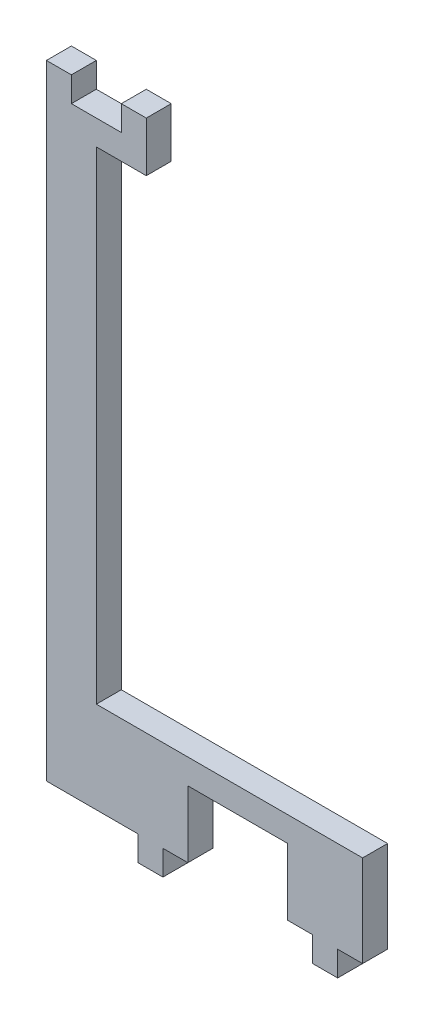
ISO-10303-21;
HEADER;
FILE_DESCRIPTION(('STEP AP214'),'2;1');
FILE_NAME('part.step','',(''),(''),'','','');
FILE_SCHEMA(('AUTOMOTIVE_DESIGN { 1 0 10303 214 1 1 1 1 }'));
ENDSEC;
DATA;
#1=APPLICATION_CONTEXT('core data for automotive mechanical design processes');
#2=APPLICATION_PROTOCOL_DEFINITION('international standard','automotive_design',2000,#1);
#3=PRODUCT_CONTEXT('',#1,'mechanical');
#4=PRODUCT('Part','Part','',(#3));
#5=PRODUCT_RELATED_PRODUCT_CATEGORY('part','',(#4));
#6=PRODUCT_DEFINITION_FORMATION('','',#4);
#7=PRODUCT_DEFINITION_CONTEXT('part definition',#1,'design');
#8=PRODUCT_DEFINITION('design','',#6,#7);
#9=PRODUCT_DEFINITION_SHAPE('','',#8);
#10=(LENGTH_UNIT() NAMED_UNIT(*) SI_UNIT(.MILLI.,.METRE.));
#11=(NAMED_UNIT(*) PLANE_ANGLE_UNIT() SI_UNIT($,.RADIAN.));
#12=(NAMED_UNIT(*) SI_UNIT($,.STERADIAN.) SOLID_ANGLE_UNIT());
#13=UNCERTAINTY_MEASURE_WITH_UNIT(LENGTH_MEASURE(1.E-05),#10,'distance_accuracy_value','');
#14=(GEOMETRIC_REPRESENTATION_CONTEXT(3) GLOBAL_UNCERTAINTY_ASSIGNED_CONTEXT((#13)) GLOBAL_UNIT_ASSIGNED_CONTEXT((#10,
#11,#12)) REPRESENTATION_CONTEXT('',''));
#15=CARTESIAN_POINT('',(0.,0.,0.));
#16=DIRECTION('',(0.,0.,1.));
#17=DIRECTION('',(1.,0.,0.));
#18=AXIS2_PLACEMENT_3D('',#15,#16,#17);
#19=CARTESIAN_POINT('',(17.,-69.,3.));
#20=DIRECTION('',(0.,1.,0.));
#21=DIRECTION('',(-1.,0.,0.));
#22=AXIS2_PLACEMENT_3D('',#19,#20,#21);
#23=PLANE('',#22);
#24=DIRECTION('',(1.,0.,0.));
#25=VECTOR('',#24,1.);
#26=CARTESIAN_POINT('',(17.,-69.,0.));
#27=LINE('',#26,#25);
#28=CARTESIAN_POINT('',(17.,-69.,0.));
#29=VERTEX_POINT('',#28);
#30=CARTESIAN_POINT('',(20.,-69.,0.));
#31=VERTEX_POINT('',#30);
#32=EDGE_CURVE('E240',#29,#31,#27,.T.);
#33=ORIENTED_EDGE('',*,*,#32,.T.);
#34=DIRECTION('',(0.,0.,-1.));
#35=VECTOR('',#34,1.);
#36=CARTESIAN_POINT('',(20.,-69.,3.));
#37=LINE('',#36,#35);
#38=CARTESIAN_POINT('',(20.,-69.,3.));
#39=VERTEX_POINT('',#38);
#40=EDGE_CURVE('E11',#39,#31,#37,.T.);
#41=ORIENTED_EDGE('',*,*,#40,.F.);
#42=DIRECTION('',(1.,0.,0.));
#43=VECTOR('',#42,1.);
#44=CARTESIAN_POINT('',(17.,-69.,3.));
#45=LINE('',#44,#43);
#46=CARTESIAN_POINT('',(17.,-69.,3.));
#47=VERTEX_POINT('',#46);
#48=EDGE_CURVE('E311',#47,#39,#45,.T.);
#49=ORIENTED_EDGE('',*,*,#48,.F.);
#50=DIRECTION('',(0.,0.,-1.));
#51=VECTOR('',#50,1.);
#52=CARTESIAN_POINT('',(17.,-69.,3.));
#53=LINE('',#52,#51);
#54=EDGE_CURVE('E236',#47,#29,#53,.T.);
#55=ORIENTED_EDGE('',*,*,#54,.T.);
#56=EDGE_LOOP('',(#33,#41,#49,#55));
#57=FACE_BOUND('',#56,.T.);
#58=ADVANCED_FACE('F43',(#57),#23,.F.);
#59=CARTESIAN_POINT('',(20.,-69.,3.));
#60=DIRECTION('',(1.,0.,0.));
#61=DIRECTION('',(0.,1.,0.));
#62=AXIS2_PLACEMENT_3D('',#59,#60,#61);
#63=PLANE('',#62);
#64=DIRECTION('',(0.,-1.,0.));
#65=VECTOR('',#64,1.);
#66=CARTESIAN_POINT('',(20.,-69.,0.));
#67=LINE('',#66,#65);
#68=CARTESIAN_POINT('',(20.,-72.,0.));
#69=VERTEX_POINT('',#68);
#70=EDGE_CURVE('E244',#31,#69,#67,.T.);
#71=ORIENTED_EDGE('',*,*,#70,.T.);
#72=DIRECTION('',(0.,0.,-1.));
#73=VECTOR('',#72,1.);
#74=CARTESIAN_POINT('',(20.,-72.,3.));
#75=LINE('',#74,#73);
#76=CARTESIAN_POINT('',(20.,-72.,3.));
#77=VERTEX_POINT('',#76);
#78=EDGE_CURVE('E52',#77,#69,#75,.T.);
#79=ORIENTED_EDGE('',*,*,#78,.F.);
#80=DIRECTION('',(0.,-1.,0.));
#81=VECTOR('',#80,1.);
#82=CARTESIAN_POINT('',(20.,-69.,3.));
#83=LINE('',#82,#81);
#84=EDGE_CURVE('E151',#39,#77,#83,.T.);
#85=ORIENTED_EDGE('',*,*,#84,.F.);
#86=ORIENTED_EDGE('',*,*,#40,.T.);
#87=EDGE_LOOP('',(#71,#79,#85,#86));
#88=FACE_BOUND('',#87,.T.);
#89=ADVANCED_FACE('F489',(#88),#63,.F.);
#90=CARTESIAN_POINT('',(20.,-72.,3.));
#91=DIRECTION('',(0.,1.,0.));
#92=DIRECTION('',(0.,0.,1.));
#93=AXIS2_PLACEMENT_3D('',#90,#91,#92);
#94=PLANE('',#93);
#95=DIRECTION('',(1.,0.,0.));
#96=VECTOR('',#95,1.);
#97=CARTESIAN_POINT('',(20.,-72.,0.));
#98=LINE('',#97,#96);
#99=CARTESIAN_POINT('',(23.,-72.,0.));
#100=VERTEX_POINT('',#99);
#101=EDGE_CURVE('E247',#69,#100,#98,.T.);
#102=ORIENTED_EDGE('',*,*,#101,.T.);
#103=DIRECTION('',(0.,0.,-1.));
#104=VECTOR('',#103,1.);
#105=CARTESIAN_POINT('',(23.,-72.,3.));
#106=LINE('',#105,#104);
#107=CARTESIAN_POINT('',(23.,-72.,3.));
#108=VERTEX_POINT('',#107);
#109=EDGE_CURVE('E386',#108,#100,#106,.T.);
#110=ORIENTED_EDGE('',*,*,#109,.F.);
#111=DIRECTION('',(1.,0.,0.));
#112=VECTOR('',#111,1.);
#113=CARTESIAN_POINT('',(20.,-72.,3.));
#114=LINE('',#113,#112);
#115=EDGE_CURVE('E396',#77,#108,#114,.T.);
#116=ORIENTED_EDGE('',*,*,#115,.F.);
#117=ORIENTED_EDGE('',*,*,#78,.T.);
#118=EDGE_LOOP('',(#102,#110,#116,#117));
#119=FACE_BOUND('',#118,.T.);
#120=ADVANCED_FACE('F394',(#119),#94,.F.);
#121=CARTESIAN_POINT('',(23.,-72.,3.));
#122=DIRECTION('',(-1.,0.,0.));
#123=DIRECTION('',(0.,0.,1.));
#124=AXIS2_PLACEMENT_3D('',#121,#122,#123);
#125=PLANE('',#124);
#126=DIRECTION('',(0.,1.,0.));
#127=VECTOR('',#126,1.);
#128=CARTESIAN_POINT('',(23.,-72.,0.));
#129=LINE('',#128,#127);
#130=CARTESIAN_POINT('',(23.,-69.,0.));
#131=VERTEX_POINT('',#130);
#132=EDGE_CURVE('E250',#100,#131,#129,.T.);
#133=ORIENTED_EDGE('',*,*,#132,.T.);
#134=DIRECTION('',(0.,0.,-1.));
#135=VECTOR('',#134,1.);
#136=CARTESIAN_POINT('',(23.,-69.,3.));
#137=LINE('',#136,#135);
#138=CARTESIAN_POINT('',(23.,-69.,3.));
#139=VERTEX_POINT('',#138);
#140=EDGE_CURVE('E382',#139,#131,#137,.T.);
#141=ORIENTED_EDGE('',*,*,#140,.F.);
#142=DIRECTION('',(0.,1.,0.));
#143=VECTOR('',#142,1.);
#144=CARTESIAN_POINT('',(23.,-72.,3.));
#145=LINE('',#144,#143);
#146=EDGE_CURVE('E415',#108,#139,#145,.T.);
#147=ORIENTED_EDGE('',*,*,#146,.F.);
#148=ORIENTED_EDGE('',*,*,#109,.T.);
#149=EDGE_LOOP('',(#133,#141,#147,#148));
#150=FACE_BOUND('',#149,.T.);
#151=ADVANCED_FACE('F405',(#150),#125,.F.);
#152=CARTESIAN_POINT('',(23.,-69.,3.));
#153=DIRECTION('',(0.,1.,0.));
#154=DIRECTION('',(-1.,0.,0.));
#155=AXIS2_PLACEMENT_3D('',#152,#153,#154);
#156=PLANE('',#155);
#157=DIRECTION('',(1.,0.,0.));
#158=VECTOR('',#157,1.);
#159=CARTESIAN_POINT('',(23.,-69.,0.));
#160=LINE('',#159,#158);
#161=CARTESIAN_POINT('',(26.,-69.,0.));
#162=VERTEX_POINT('',#161);
#163=EDGE_CURVE('E253',#131,#162,#160,.T.);
#164=ORIENTED_EDGE('',*,*,#163,.T.);
#165=DIRECTION('',(0.,0.,-1.));
#166=VECTOR('',#165,1.);
#167=CARTESIAN_POINT('',(26.,-69.,3.));
#168=LINE('',#167,#166);
#169=CARTESIAN_POINT('',(26.,-69.,3.));
#170=VERTEX_POINT('',#169);
#171=EDGE_CURVE('E378',#170,#162,#168,.T.);
#172=ORIENTED_EDGE('',*,*,#171,.F.);
#173=DIRECTION('',(1.,0.,0.));
#174=VECTOR('',#173,1.);
#175=CARTESIAN_POINT('',(23.,-69.,3.));
#176=LINE('',#175,#174);
#177=EDGE_CURVE('E411',#139,#170,#176,.T.);
#178=ORIENTED_EDGE('',*,*,#177,.F.);
#179=ORIENTED_EDGE('',*,*,#140,.T.);
#180=EDGE_LOOP('',(#164,#172,#178,#179));
#181=FACE_BOUND('',#180,.T.);
#182=ADVANCED_FACE('F409',(#181),#156,.F.);
#183=CARTESIAN_POINT('',(26.,-58.,3.));
#184=DIRECTION('',(-1.,0.,0.));
#185=DIRECTION('',(0.,0.,1.));
#186=AXIS2_PLACEMENT_3D('',#183,#184,#185);
#187=PLANE('',#186);
#188=DIRECTION('',(0.,1.,0.));
#189=VECTOR('',#188,1.);
#190=CARTESIAN_POINT('',(26.,-58.,0.));
#191=LINE('',#190,#189);
#192=CARTESIAN_POINT('',(26.,-58.,0.));
#193=VERTEX_POINT('',#192);
#194=EDGE_CURVE('E256',#162,#193,#191,.T.);
#195=ORIENTED_EDGE('',*,*,#194,.T.);
#196=DIRECTION('',(0.,0.,-1.));
#197=VECTOR('',#196,1.);
#198=CARTESIAN_POINT('',(26.,-58.,3.));
#199=LINE('',#198,#197);
#200=CARTESIAN_POINT('',(26.,-58.,3.));
#201=VERTEX_POINT('',#200);
#202=EDGE_CURVE('E374',#201,#193,#199,.T.);
#203=ORIENTED_EDGE('',*,*,#202,.F.);
#204=DIRECTION('',(0.,1.,0.));
#205=VECTOR('',#204,1.);
#206=CARTESIAN_POINT('',(26.,-58.,3.));
#207=LINE('',#206,#205);
#208=EDGE_CURVE('E414',#170,#201,#207,.T.);
#209=ORIENTED_EDGE('',*,*,#208,.F.);
#210=ORIENTED_EDGE('',*,*,#171,.T.);
#211=EDGE_LOOP('',(#195,#203,#209,#210));
#212=FACE_BOUND('',#211,.T.);
#213=ADVANCED_FACE('F502',(#212),#187,.F.);
#214=CARTESIAN_POINT('',(-5.99999999999999,-58.,3.));
#215=DIRECTION('',(0.,-1.,0.));
#216=DIRECTION('',(1.,0.,0.));
#217=AXIS2_PLACEMENT_3D('',#214,#215,#216);
#218=PLANE('',#217);
#219=DIRECTION('',(-1.,0.,0.));
#220=VECTOR('',#219,1.);
#221=CARTESIAN_POINT('',(-5.99999999999999,-58.,0.));
#222=LINE('',#221,#220);
#223=CARTESIAN_POINT('',(-5.99999999999999,-58.,0.));
#224=VERTEX_POINT('',#223);
#225=EDGE_CURVE('E259',#193,#224,#222,.T.);
#226=ORIENTED_EDGE('',*,*,#225,.T.);
#227=DIRECTION('',(0.,0.,-1.));
#228=VECTOR('',#227,1.);
#229=CARTESIAN_POINT('',(-5.99999999999999,-58.,3.));
#230=LINE('',#229,#228);
#231=CARTESIAN_POINT('',(-5.99999999999999,-58.,3.));
#232=VERTEX_POINT('',#231);
#233=EDGE_CURVE('E370',#232,#224,#230,.T.);
#234=ORIENTED_EDGE('',*,*,#233,.F.);
#235=DIRECTION('',(-1.,0.,0.));
#236=VECTOR('',#235,1.);
#237=CARTESIAN_POINT('',(-5.99999999999999,-58.,3.));
#238=LINE('',#237,#236);
#239=EDGE_CURVE('E419',#201,#232,#238,.T.);
#240=ORIENTED_EDGE('',*,*,#239,.F.);
#241=ORIENTED_EDGE('',*,*,#202,.T.);
#242=EDGE_LOOP('',(#226,#234,#240,#241));
#243=FACE_BOUND('',#242,.T.);
#244=ADVANCED_FACE('F505',(#243),#218,.F.);
#245=CARTESIAN_POINT('',(-6.,0.,3.));
#246=DIRECTION('',(-1.,0.,0.));
#247=DIRECTION('',(0.,-1.,0.));
#248=AXIS2_PLACEMENT_3D('',#245,#246,#247);
#249=PLANE('',#248);
#250=DIRECTION('',(0.,1.,0.));
#251=VECTOR('',#250,1.);
#252=CARTESIAN_POINT('',(-6.,0.,0.));
#253=LINE('',#252,#251);
#254=CARTESIAN_POINT('',(-6.,0.,0.));
#255=VERTEX_POINT('',#254);
#256=EDGE_CURVE('E262',#224,#255,#253,.T.);
#257=ORIENTED_EDGE('',*,*,#256,.T.);
#258=DIRECTION('',(0.,0.,-1.));
#259=VECTOR('',#258,1.);
#260=CARTESIAN_POINT('',(-6.,0.,3.));
#261=LINE('',#260,#259);
#262=CARTESIAN_POINT('',(-6.,0.,3.));
#263=VERTEX_POINT('',#262);
#264=EDGE_CURVE('E366',#263,#255,#261,.T.);
#265=ORIENTED_EDGE('',*,*,#264,.F.);
#266=DIRECTION('',(0.,1.,0.));
#267=VECTOR('',#266,1.);
#268=CARTESIAN_POINT('',(-6.,0.,3.));
#269=LINE('',#268,#267);
#270=EDGE_CURVE('E426',#232,#263,#269,.T.);
#271=ORIENTED_EDGE('',*,*,#270,.F.);
#272=ORIENTED_EDGE('',*,*,#233,.T.);
#273=EDGE_LOOP('',(#257,#265,#271,#272));
#274=FACE_BOUND('',#273,.T.);
#275=ADVANCED_FACE('F509',(#274),#249,.F.);
#276=CARTESIAN_POINT('',(0.,0.,3.));
#277=DIRECTION('',(0.,1.,0.));
#278=DIRECTION('',(-1.,0.,0.));
#279=AXIS2_PLACEMENT_3D('',#276,#277,#278);
#280=PLANE('',#279);
#281=DIRECTION('',(1.,0.,0.));
#282=VECTOR('',#281,1.);
#283=CARTESIAN_POINT('',(0.,0.,0.));
#284=LINE('',#283,#282);
#285=CARTESIAN_POINT('',(0.,0.,0.));
#286=VERTEX_POINT('',#285);
#287=EDGE_CURVE('E265',#255,#286,#284,.T.);
#288=ORIENTED_EDGE('',*,*,#287,.T.);
#289=DIRECTION('',(0.,0.,-1.));
#290=VECTOR('',#289,1.);
#291=CARTESIAN_POINT('',(0.,0.,3.));
#292=LINE('',#291,#290);
#293=CARTESIAN_POINT('',(0.,0.,3.));
#294=VERTEX_POINT('',#293);
#295=EDGE_CURVE('E362',#294,#286,#292,.T.);
#296=ORIENTED_EDGE('',*,*,#295,.F.);
#297=DIRECTION('',(1.,0.,0.));
#298=VECTOR('',#297,1.);
#299=CARTESIAN_POINT('',(0.,0.,3.));
#300=LINE('',#299,#298);
#301=EDGE_CURVE('E429',#263,#294,#300,.T.);
#302=ORIENTED_EDGE('',*,*,#301,.F.);
#303=ORIENTED_EDGE('',*,*,#264,.T.);
#304=EDGE_LOOP('',(#288,#296,#302,#303));
#305=FACE_BOUND('',#304,.T.);
#306=ADVANCED_FACE('F513',(#305),#280,.F.);
#307=CARTESIAN_POINT('',(0.,6.,3.));
#308=DIRECTION('',(-1.,0.,0.));
#309=DIRECTION('',(0.,0.,1.));
#310=AXIS2_PLACEMENT_3D('',#307,#308,#309);
#311=PLANE('',#310);
#312=DIRECTION('',(0.,1.,0.));
#313=VECTOR('',#312,1.);
#314=CARTESIAN_POINT('',(0.,6.,0.));
#315=LINE('',#314,#313);
#316=CARTESIAN_POINT('',(0.,6.,0.));
#317=VERTEX_POINT('',#316);
#318=EDGE_CURVE('E268',#286,#317,#315,.T.);
#319=ORIENTED_EDGE('',*,*,#318,.T.);
#320=DIRECTION('',(0.,0.,-1.));
#321=VECTOR('',#320,1.);
#322=CARTESIAN_POINT('',(0.,6.,3.));
#323=LINE('',#322,#321);
#324=CARTESIAN_POINT('',(0.,6.,3.));
#325=VERTEX_POINT('',#324);
#326=EDGE_CURVE('E358',#325,#317,#323,.T.);
#327=ORIENTED_EDGE('',*,*,#326,.F.);
#328=DIRECTION('',(0.,1.,0.));
#329=VECTOR('',#328,1.);
#330=CARTESIAN_POINT('',(0.,6.,3.));
#331=LINE('',#330,#329);
#332=EDGE_CURVE('E432',#294,#325,#331,.T.);
#333=ORIENTED_EDGE('',*,*,#332,.F.);
#334=ORIENTED_EDGE('',*,*,#295,.T.);
#335=EDGE_LOOP('',(#319,#327,#333,#334));
#336=FACE_BOUND('',#335,.T.);
#337=ADVANCED_FACE('F517',(#336),#311,.F.);
#338=CARTESIAN_POINT('',(-3.,6.,3.));
#339=DIRECTION('',(0.,-1.,0.));
#340=DIRECTION('',(1.,0.,0.));
#341=AXIS2_PLACEMENT_3D('',#338,#339,#340);
#342=PLANE('',#341);
#343=DIRECTION('',(-1.,0.,0.));
#344=VECTOR('',#343,1.);
#345=CARTESIAN_POINT('',(-3.,6.,0.));
#346=LINE('',#345,#344);
#347=CARTESIAN_POINT('',(-3.,6.,0.));
#348=VERTEX_POINT('',#347);
#349=EDGE_CURVE('E271',#317,#348,#346,.T.);
#350=ORIENTED_EDGE('',*,*,#349,.T.);
#351=DIRECTION('',(0.,0.,-1.));
#352=VECTOR('',#351,1.);
#353=CARTESIAN_POINT('',(-3.,6.,3.));
#354=LINE('',#353,#352);
#355=CARTESIAN_POINT('',(-3.,6.,3.));
#356=VERTEX_POINT('',#355);
#357=EDGE_CURVE('E354',#356,#348,#354,.T.);
#358=ORIENTED_EDGE('',*,*,#357,.F.);
#359=DIRECTION('',(-1.,0.,0.));
#360=VECTOR('',#359,1.);
#361=CARTESIAN_POINT('',(-3.,6.,3.));
#362=LINE('',#361,#360);
#363=EDGE_CURVE('E435',#325,#356,#362,.T.);
#364=ORIENTED_EDGE('',*,*,#363,.F.);
#365=ORIENTED_EDGE('',*,*,#326,.T.);
#366=EDGE_LOOP('',(#350,#358,#364,#365));
#367=FACE_BOUND('',#366,.T.);
#368=ADVANCED_FACE('F521',(#367),#342,.F.);
#369=CARTESIAN_POINT('',(-3.,2.99999999999999,3.));
#370=DIRECTION('',(1.,0.,0.));
#371=DIRECTION('',(0.,0.,-1.));
#372=AXIS2_PLACEMENT_3D('',#369,#370,#371);
#373=PLANE('',#372);
#374=DIRECTION('',(0.,-1.,0.));
#375=VECTOR('',#374,1.);
#376=CARTESIAN_POINT('',(-3.,2.99999999999999,0.));
#377=LINE('',#376,#375);
#378=CARTESIAN_POINT('',(-3.,2.99999999999999,0.));
#379=VERTEX_POINT('',#378);
#380=EDGE_CURVE('E274',#348,#379,#377,.T.);
#381=ORIENTED_EDGE('',*,*,#380,.T.);
#382=DIRECTION('',(0.,0.,-1.));
#383=VECTOR('',#382,1.);
#384=CARTESIAN_POINT('',(-3.,2.99999999999999,3.));
#385=LINE('',#384,#383);
#386=CARTESIAN_POINT('',(-3.,2.99999999999999,3.));
#387=VERTEX_POINT('',#386);
#388=EDGE_CURVE('E350',#387,#379,#385,.T.);
#389=ORIENTED_EDGE('',*,*,#388,.F.);
#390=DIRECTION('',(0.,-1.,0.));
#391=VECTOR('',#390,1.);
#392=CARTESIAN_POINT('',(-3.,2.99999999999999,3.));
#393=LINE('',#392,#391);
#394=EDGE_CURVE('E438',#356,#387,#393,.T.);
#395=ORIENTED_EDGE('',*,*,#394,.F.);
#396=ORIENTED_EDGE('',*,*,#357,.T.);
#397=EDGE_LOOP('',(#381,#389,#395,#396));
#398=FACE_BOUND('',#397,.T.);
#399=ADVANCED_FACE('F525',(#398),#373,.F.);
#400=CARTESIAN_POINT('',(-9.,3.,3.));
#401=DIRECTION('',(0.,-1.,0.));
#402=DIRECTION('',(1.,0.,0.));
#403=AXIS2_PLACEMENT_3D('',#400,#401,#402);
#404=PLANE('',#403);
#405=DIRECTION('',(-1.,0.,0.));
#406=VECTOR('',#405,1.);
#407=CARTESIAN_POINT('',(-9.,3.,0.));
#408=LINE('',#407,#406);
#409=CARTESIAN_POINT('',(-9.,3.,0.));
#410=VERTEX_POINT('',#409);
#411=EDGE_CURVE('E277',#379,#410,#408,.T.);
#412=ORIENTED_EDGE('',*,*,#411,.T.);
#413=DIRECTION('',(0.,0.,-1.));
#414=VECTOR('',#413,1.);
#415=CARTESIAN_POINT('',(-9.,3.,3.));
#416=LINE('',#415,#414);
#417=CARTESIAN_POINT('',(-9.,3.,3.));
#418=VERTEX_POINT('',#417);
#419=EDGE_CURVE('E346',#418,#410,#416,.T.);
#420=ORIENTED_EDGE('',*,*,#419,.F.);
#421=DIRECTION('',(-1.,0.,0.));
#422=VECTOR('',#421,1.);
#423=CARTESIAN_POINT('',(-9.,3.,3.));
#424=LINE('',#423,#422);
#425=EDGE_CURVE('E441',#387,#418,#424,.T.);
#426=ORIENTED_EDGE('',*,*,#425,.F.);
#427=ORIENTED_EDGE('',*,*,#388,.T.);
#428=EDGE_LOOP('',(#412,#420,#426,#427));
#429=FACE_BOUND('',#428,.T.);
#430=ADVANCED_FACE('F529',(#429),#404,.F.);
#431=CARTESIAN_POINT('',(-9.,6.,3.));
#432=DIRECTION('',(-1.,0.,0.));
#433=DIRECTION('',(0.,-1.,0.));
#434=AXIS2_PLACEMENT_3D('',#431,#432,#433);
#435=PLANE('',#434);
#436=DIRECTION('',(0.,1.,0.));
#437=VECTOR('',#436,1.);
#438=CARTESIAN_POINT('',(-9.,6.,0.));
#439=LINE('',#438,#437);
#440=CARTESIAN_POINT('',(-9.,6.,0.));
#441=VERTEX_POINT('',#440);
#442=EDGE_CURVE('E280',#410,#441,#439,.T.);
#443=ORIENTED_EDGE('',*,*,#442,.T.);
#444=DIRECTION('',(0.,0.,-1.));
#445=VECTOR('',#444,1.);
#446=CARTESIAN_POINT('',(-9.,6.,3.));
#447=LINE('',#446,#445);
#448=CARTESIAN_POINT('',(-9.,6.,3.));
#449=VERTEX_POINT('',#448);
#450=EDGE_CURVE('E342',#449,#441,#447,.T.);
#451=ORIENTED_EDGE('',*,*,#450,.F.);
#452=DIRECTION('',(0.,1.,0.));
#453=VECTOR('',#452,1.);
#454=CARTESIAN_POINT('',(-9.,6.,3.));
#455=LINE('',#454,#453);
#456=EDGE_CURVE('E444',#418,#449,#455,.T.);
#457=ORIENTED_EDGE('',*,*,#456,.F.);
#458=ORIENTED_EDGE('',*,*,#419,.T.);
#459=EDGE_LOOP('',(#443,#451,#457,#458));
#460=FACE_BOUND('',#459,.T.);
#461=ADVANCED_FACE('F533',(#460),#435,.F.);
#462=CARTESIAN_POINT('',(-12.,6.,3.));
#463=DIRECTION('',(0.,-1.,0.));
#464=DIRECTION('',(1.,0.,0.));
#465=AXIS2_PLACEMENT_3D('',#462,#463,#464);
#466=PLANE('',#465);
#467=DIRECTION('',(-1.,0.,0.));
#468=VECTOR('',#467,1.);
#469=CARTESIAN_POINT('',(-12.,6.,0.));
#470=LINE('',#469,#468);
#471=CARTESIAN_POINT('',(-12.,6.,0.));
#472=VERTEX_POINT('',#471);
#473=EDGE_CURVE('E283',#441,#472,#470,.T.);
#474=ORIENTED_EDGE('',*,*,#473,.T.);
#475=DIRECTION('',(0.,0.,-1.));
#476=VECTOR('',#475,1.);
#477=CARTESIAN_POINT('',(-12.,6.,3.));
#478=LINE('',#477,#476);
#479=CARTESIAN_POINT('',(-12.,6.,3.));
#480=VERTEX_POINT('',#479);
#481=EDGE_CURVE('E338',#480,#472,#478,.T.);
#482=ORIENTED_EDGE('',*,*,#481,.F.);
#483=DIRECTION('',(-1.,0.,0.));
#484=VECTOR('',#483,1.);
#485=CARTESIAN_POINT('',(-12.,6.,3.));
#486=LINE('',#485,#484);
#487=EDGE_CURVE('E447',#449,#480,#486,.T.);
#488=ORIENTED_EDGE('',*,*,#487,.F.);
#489=ORIENTED_EDGE('',*,*,#450,.T.);
#490=EDGE_LOOP('',(#474,#482,#488,#489));
#491=FACE_BOUND('',#490,.T.);
#492=ADVANCED_FACE('F537',(#491),#466,.F.);
#493=CARTESIAN_POINT('',(-12.,-69.,3.));
#494=DIRECTION('',(1.,0.,0.));
#495=DIRECTION('',(0.,0.,-1.));
#496=AXIS2_PLACEMENT_3D('',#493,#494,#495);
#497=PLANE('',#496);
#498=DIRECTION('',(0.,-1.,0.));
#499=VECTOR('',#498,1.);
#500=CARTESIAN_POINT('',(-12.,-69.,0.));
#501=LINE('',#500,#499);
#502=CARTESIAN_POINT('',(-12.,-69.,0.));
#503=VERTEX_POINT('',#502);
#504=EDGE_CURVE('E287',#472,#503,#501,.T.);
#505=ORIENTED_EDGE('',*,*,#504,.T.);
#506=DIRECTION('',(0.,0.,-1.));
#507=VECTOR('',#506,1.);
#508=CARTESIAN_POINT('',(-12.,-69.,3.));
#509=LINE('',#508,#507);
#510=CARTESIAN_POINT('',(-12.,-69.,3.));
#511=VERTEX_POINT('',#510);
#512=EDGE_CURVE('E334',#511,#503,#509,.T.);
#513=ORIENTED_EDGE('',*,*,#512,.F.);
#514=DIRECTION('',(0.,-1.,0.));
#515=VECTOR('',#514,1.);
#516=CARTESIAN_POINT('',(-12.,3.,3.));
#517=LINE('',#516,#515);
#518=EDGE_CURVE('E450',#480,#511,#517,.T.);
#519=ORIENTED_EDGE('',*,*,#518,.F.);
#520=ORIENTED_EDGE('',*,*,#481,.T.);
#521=EDGE_LOOP('',(#505,#513,#519,#520));
#522=FACE_BOUND('',#521,.T.);
#523=ADVANCED_FACE('F541',(#522),#497,.F.);
#524=CARTESIAN_POINT('',(-12.,-69.,3.));
#525=DIRECTION('',(0.,1.,0.));
#526=DIRECTION('',(-1.,0.,0.));
#527=AXIS2_PLACEMENT_3D('',#524,#525,#526);
#528=PLANE('',#527);
#529=DIRECTION('',(1.,0.,0.));
#530=VECTOR('',#529,1.);
#531=CARTESIAN_POINT('',(-12.,-69.,0.));
#532=LINE('',#531,#530);
#533=CARTESIAN_POINT('',(-0.999999999999994,-69.,0.));
#534=VERTEX_POINT('',#533);
#535=EDGE_CURVE('E290',#503,#534,#532,.T.);
#536=ORIENTED_EDGE('',*,*,#535,.T.);
#537=DIRECTION('',(0.,0.,-1.));
#538=VECTOR('',#537,1.);
#539=CARTESIAN_POINT('',(-0.999999999999994,-69.,3.));
#540=LINE('',#539,#538);
#541=CARTESIAN_POINT('',(-0.999999999999994,-69.,3.));
#542=VERTEX_POINT('',#541);
#543=EDGE_CURVE('E330',#542,#534,#540,.T.);
#544=ORIENTED_EDGE('',*,*,#543,.F.);
#545=DIRECTION('',(1.,0.,0.));
#546=VECTOR('',#545,1.);
#547=CARTESIAN_POINT('',(-12.,-69.,3.));
#548=LINE('',#547,#546);
#549=EDGE_CURVE('E453',#511,#542,#548,.T.);
#550=ORIENTED_EDGE('',*,*,#549,.F.);
#551=ORIENTED_EDGE('',*,*,#512,.T.);
#552=EDGE_LOOP('',(#536,#544,#550,#551));
#553=FACE_BOUND('',#552,.T.);
#554=ADVANCED_FACE('F545',(#553),#528,.F.);
#555=CARTESIAN_POINT('',(-0.999999999999994,-69.,3.));
#556=DIRECTION('',(1.,0.,0.));
#557=DIRECTION('',(0.,1.,0.));
#558=AXIS2_PLACEMENT_3D('',#555,#556,#557);
#559=PLANE('',#558);
#560=DIRECTION('',(0.,-1.,0.));
#561=VECTOR('',#560,1.);
#562=CARTESIAN_POINT('',(-0.999999999999994,-69.,0.));
#563=LINE('',#562,#561);
#564=CARTESIAN_POINT('',(-0.999999999999993,-72.,0.));
#565=VERTEX_POINT('',#564);
#566=EDGE_CURVE('E293',#534,#565,#563,.T.);
#567=ORIENTED_EDGE('',*,*,#566,.T.);
#568=DIRECTION('',(0.,0.,-1.));
#569=VECTOR('',#568,1.);
#570=CARTESIAN_POINT('',(-0.999999999999993,-72.,3.));
#571=LINE('',#570,#569);
#572=CARTESIAN_POINT('',(-0.999999999999993,-72.,3.));
#573=VERTEX_POINT('',#572);
#574=EDGE_CURVE('E326',#573,#565,#571,.T.);
#575=ORIENTED_EDGE('',*,*,#574,.F.);
#576=DIRECTION('',(0.,-1.,0.));
#577=VECTOR('',#576,1.);
#578=CARTESIAN_POINT('',(-0.999999999999994,-69.,3.));
#579=LINE('',#578,#577);
#580=EDGE_CURVE('E456',#542,#573,#579,.T.);
#581=ORIENTED_EDGE('',*,*,#580,.F.);
#582=ORIENTED_EDGE('',*,*,#543,.T.);
#583=EDGE_LOOP('',(#567,#575,#581,#582));
#584=FACE_BOUND('',#583,.T.);
#585=ADVANCED_FACE('F549',(#584),#559,.F.);
#586=CARTESIAN_POINT('',(-0.999999999999993,-72.,3.));
#587=DIRECTION('',(0.,1.,0.));
#588=DIRECTION('',(0.,0.,1.));
#589=AXIS2_PLACEMENT_3D('',#586,#587,#588);
#590=PLANE('',#589);
#591=DIRECTION('',(1.,0.,0.));
#592=VECTOR('',#591,1.);
#593=CARTESIAN_POINT('',(-0.999999999999993,-72.,0.));
#594=LINE('',#593,#592);
#595=CARTESIAN_POINT('',(2.00000000000001,-72.,0.));
#596=VERTEX_POINT('',#595);
#597=EDGE_CURVE('E296',#565,#596,#594,.T.);
#598=ORIENTED_EDGE('',*,*,#597,.T.);
#599=DIRECTION('',(0.,0.,-1.));
#600=VECTOR('',#599,1.);
#601=CARTESIAN_POINT('',(2.00000000000001,-72.,3.));
#602=LINE('',#601,#600);
#603=CARTESIAN_POINT('',(2.00000000000001,-72.,3.));
#604=VERTEX_POINT('',#603);
#605=EDGE_CURVE('E322',#604,#596,#602,.T.);
#606=ORIENTED_EDGE('',*,*,#605,.F.);
#607=DIRECTION('',(1.,0.,0.));
#608=VECTOR('',#607,1.);
#609=CARTESIAN_POINT('',(-0.999999999999993,-72.,3.));
#610=LINE('',#609,#608);
#611=EDGE_CURVE('E459',#573,#604,#610,.T.);
#612=ORIENTED_EDGE('',*,*,#611,.F.);
#613=ORIENTED_EDGE('',*,*,#574,.T.);
#614=EDGE_LOOP('',(#598,#606,#612,#613));
#615=FACE_BOUND('',#614,.T.);
#616=ADVANCED_FACE('F553',(#615),#590,.F.);
#617=CARTESIAN_POINT('',(2.00000000000001,-72.,3.));
#618=DIRECTION('',(-1.,0.,0.));
#619=DIRECTION('',(0.,0.,1.));
#620=AXIS2_PLACEMENT_3D('',#617,#618,#619);
#621=PLANE('',#620);
#622=DIRECTION('',(0.,1.,0.));
#623=VECTOR('',#622,1.);
#624=CARTESIAN_POINT('',(2.00000000000001,-72.,0.));
#625=LINE('',#624,#623);
#626=CARTESIAN_POINT('',(2.00000000000001,-69.,0.));
#627=VERTEX_POINT('',#626);
#628=EDGE_CURVE('E299',#596,#627,#625,.T.);
#629=ORIENTED_EDGE('',*,*,#628,.T.);
#630=DIRECTION('',(0.,0.,-1.));
#631=VECTOR('',#630,1.);
#632=CARTESIAN_POINT('',(2.00000000000001,-69.,3.));
#633=LINE('',#632,#631);
#634=CARTESIAN_POINT('',(2.00000000000001,-69.,3.));
#635=VERTEX_POINT('',#634);
#636=EDGE_CURVE('E318',#635,#627,#633,.T.);
#637=ORIENTED_EDGE('',*,*,#636,.F.);
#638=DIRECTION('',(0.,1.,0.));
#639=VECTOR('',#638,1.);
#640=CARTESIAN_POINT('',(2.00000000000001,-72.,3.));
#641=LINE('',#640,#639);
#642=EDGE_CURVE('E462',#604,#635,#641,.T.);
#643=ORIENTED_EDGE('',*,*,#642,.F.);
#644=ORIENTED_EDGE('',*,*,#605,.T.);
#645=EDGE_LOOP('',(#629,#637,#643,#644));
#646=FACE_BOUND('',#645,.T.);
#647=ADVANCED_FACE('F470',(#646),#621,.F.);
#648=CARTESIAN_POINT('',(2.00000000000001,-69.,3.));
#649=DIRECTION('',(0.,1.,0.));
#650=DIRECTION('',(-1.,0.,0.));
#651=AXIS2_PLACEMENT_3D('',#648,#649,#650);
#652=PLANE('',#651);
#653=DIRECTION('',(1.,0.,0.));
#654=VECTOR('',#653,1.);
#655=CARTESIAN_POINT('',(2.00000000000001,-69.,0.));
#656=LINE('',#655,#654);
#657=CARTESIAN_POINT('',(5.00000000000001,-69.,0.));
#658=VERTEX_POINT('',#657);
#659=EDGE_CURVE('E302',#627,#658,#656,.T.);
#660=ORIENTED_EDGE('',*,*,#659,.T.);
#661=DIRECTION('',(0.,0.,-1.));
#662=VECTOR('',#661,1.);
#663=CARTESIAN_POINT('',(5.00000000000001,-69.,3.));
#664=LINE('',#663,#662);
#665=CARTESIAN_POINT('',(5.00000000000001,-69.,3.));
#666=VERTEX_POINT('',#665);
#667=EDGE_CURVE('E229',#666,#658,#664,.T.);
#668=ORIENTED_EDGE('',*,*,#667,.F.);
#669=DIRECTION('',(1.,0.,0.));
#670=VECTOR('',#669,1.);
#671=CARTESIAN_POINT('',(2.00000000000001,-69.,3.));
#672=LINE('',#671,#670);
#673=EDGE_CURVE('E218',#635,#666,#672,.T.);
#674=ORIENTED_EDGE('',*,*,#673,.F.);
#675=ORIENTED_EDGE('',*,*,#636,.T.);
#676=EDGE_LOOP('',(#660,#668,#674,#675));
#677=FACE_BOUND('',#676,.T.);
#678=ADVANCED_FACE('F474',(#677),#652,.F.);
#679=CARTESIAN_POINT('',(5.,-61.,3.));
#680=DIRECTION('',(-1.,0.,0.));
#681=DIRECTION('',(0.,-1.,0.));
#682=AXIS2_PLACEMENT_3D('',#679,#680,#681);
#683=PLANE('',#682);
#684=DIRECTION('',(0.,1.,0.));
#685=VECTOR('',#684,1.);
#686=CARTESIAN_POINT('',(5.,-61.,0.));
#687=LINE('',#686,#685);
#688=CARTESIAN_POINT('',(5.,-61.,0.));
#689=VERTEX_POINT('',#688);
#690=EDGE_CURVE('E227',#658,#689,#687,.T.);
#691=ORIENTED_EDGE('',*,*,#690,.T.);
#692=DIRECTION('',(0.,0.,-1.));
#693=VECTOR('',#692,1.);
#694=CARTESIAN_POINT('',(5.,-61.,3.));
#695=LINE('',#694,#693);
#696=CARTESIAN_POINT('',(5.,-61.,3.));
#697=VERTEX_POINT('',#696);
#698=EDGE_CURVE('E224',#697,#689,#695,.T.);
#699=ORIENTED_EDGE('',*,*,#698,.F.);
#700=DIRECTION('',(0.,1.,0.));
#701=VECTOR('',#700,1.);
#702=CARTESIAN_POINT('',(5.,-61.,3.));
#703=LINE('',#702,#701);
#704=EDGE_CURVE('E212',#666,#697,#703,.T.);
#705=ORIENTED_EDGE('',*,*,#704,.F.);
#706=ORIENTED_EDGE('',*,*,#667,.T.);
#707=EDGE_LOOP('',(#691,#699,#705,#706));
#708=FACE_BOUND('',#707,.T.);
#709=ADVANCED_FACE('F225',(#708),#683,.F.);
#710=CARTESIAN_POINT('',(17.,-61.,3.));
#711=DIRECTION('',(0.,1.,0.));
#712=DIRECTION('',(0.,0.,1.));
#713=AXIS2_PLACEMENT_3D('',#710,#711,#712);
#714=PLANE('',#713);
#715=DIRECTION('',(1.,0.,0.));
#716=VECTOR('',#715,1.);
#717=CARTESIAN_POINT('',(17.,-61.,0.));
#718=LINE('',#717,#716);
#719=CARTESIAN_POINT('',(17.,-61.,0.));
#720=VERTEX_POINT('',#719);
#721=EDGE_CURVE('E137',#689,#720,#718,.T.);
#722=ORIENTED_EDGE('',*,*,#721,.T.);
#723=DIRECTION('',(0.,0.,-1.));
#724=VECTOR('',#723,1.);
#725=CARTESIAN_POINT('',(17.,-61.,3.));
#726=LINE('',#725,#724);
#727=CARTESIAN_POINT('',(17.,-61.,3.));
#728=VERTEX_POINT('',#727);
#729=EDGE_CURVE('E230',#728,#720,#726,.T.);
#730=ORIENTED_EDGE('',*,*,#729,.F.);
#731=DIRECTION('',(1.,0.,0.));
#732=VECTOR('',#731,1.);
#733=CARTESIAN_POINT('',(17.,-61.,3.));
#734=LINE('',#733,#732);
#735=EDGE_CURVE('E216',#697,#728,#734,.T.);
#736=ORIENTED_EDGE('',*,*,#735,.F.);
#737=ORIENTED_EDGE('',*,*,#698,.T.);
#738=EDGE_LOOP('',(#722,#730,#736,#737));
#739=FACE_BOUND('',#738,.T.);
#740=ADVANCED_FACE('F232',(#739),#714,.F.);
#741=CARTESIAN_POINT('',(17.,-69.,3.));
#742=DIRECTION('',(1.,0.,0.));
#743=DIRECTION('',(0.,0.,-1.));
#744=AXIS2_PLACEMENT_3D('',#741,#742,#743);
#745=PLANE('',#744);
#746=DIRECTION('',(0.,-1.,0.));
#747=VECTOR('',#746,1.);
#748=CARTESIAN_POINT('',(17.,-69.,0.));
#749=LINE('',#748,#747);
#750=EDGE_CURVE('E143',#720,#29,#749,.T.);
#751=ORIENTED_EDGE('',*,*,#750,.T.);
#752=ORIENTED_EDGE('',*,*,#54,.F.);
#753=DIRECTION('',(0.,-1.,0.));
#754=VECTOR('',#753,1.);
#755=CARTESIAN_POINT('',(17.,-69.,3.));
#756=LINE('',#755,#754);
#757=EDGE_CURVE('E60',#728,#47,#756,.T.);
#758=ORIENTED_EDGE('',*,*,#757,.F.);
#759=ORIENTED_EDGE('',*,*,#729,.T.);
#760=EDGE_LOOP('',(#751,#752,#758,#759));
#761=FACE_BOUND('',#760,.T.);
#762=ADVANCED_FACE('F478',(#761),#745,.F.);
#763=CARTESIAN_POINT('',(0.,0.,3.));
#764=DIRECTION('',(0.,0.,-1.));
#765=DIRECTION('',(-1.,0.,0.));
#766=AXIS2_PLACEMENT_3D('',#763,#764,#765);
#767=PLANE('',#766);
#768=ORIENTED_EDGE('',*,*,#48,.T.);
#769=ORIENTED_EDGE('',*,*,#84,.T.);
#770=ORIENTED_EDGE('',*,*,#115,.T.);
#771=ORIENTED_EDGE('',*,*,#146,.T.);
#772=ORIENTED_EDGE('',*,*,#177,.T.);
#773=ORIENTED_EDGE('',*,*,#208,.T.);
#774=ORIENTED_EDGE('',*,*,#239,.T.);
#775=ORIENTED_EDGE('',*,*,#270,.T.);
#776=ORIENTED_EDGE('',*,*,#301,.T.);
#777=ORIENTED_EDGE('',*,*,#332,.T.);
#778=ORIENTED_EDGE('',*,*,#363,.T.);
#779=ORIENTED_EDGE('',*,*,#394,.T.);
#780=ORIENTED_EDGE('',*,*,#425,.T.);
#781=ORIENTED_EDGE('',*,*,#456,.T.);
#782=ORIENTED_EDGE('',*,*,#487,.T.);
#783=ORIENTED_EDGE('',*,*,#518,.T.);
#784=ORIENTED_EDGE('',*,*,#549,.T.);
#785=ORIENTED_EDGE('',*,*,#580,.T.);
#786=ORIENTED_EDGE('',*,*,#611,.T.);
#787=ORIENTED_EDGE('',*,*,#642,.T.);
#788=ORIENTED_EDGE('',*,*,#673,.T.);
#789=ORIENTED_EDGE('',*,*,#704,.T.);
#790=ORIENTED_EDGE('',*,*,#735,.T.);
#791=ORIENTED_EDGE('',*,*,#757,.T.);
#792=EDGE_LOOP('',(#768,#769,#770,#771,#772,#773,#774,#775,#776,#777,#778,#779,#780,#781,#782,
#783,#784,#785,#786,#787,#788,#789,#790,#791));
#793=FACE_BOUND('',#792,.T.);
#794=ADVANCED_FACE('F214',(#793),#767,.F.);
#795=CARTESIAN_POINT('',(0.,0.,0.));
#796=DIRECTION('',(0.,0.,-1.));
#797=DIRECTION('',(-1.,0.,0.));
#798=AXIS2_PLACEMENT_3D('',#795,#796,#797);
#799=PLANE('',#798);
#800=ORIENTED_EDGE('',*,*,#32,.F.);
#801=ORIENTED_EDGE('',*,*,#750,.F.);
#802=ORIENTED_EDGE('',*,*,#721,.F.);
#803=ORIENTED_EDGE('',*,*,#690,.F.);
#804=ORIENTED_EDGE('',*,*,#659,.F.);
#805=ORIENTED_EDGE('',*,*,#628,.F.);
#806=ORIENTED_EDGE('',*,*,#597,.F.);
#807=ORIENTED_EDGE('',*,*,#566,.F.);
#808=ORIENTED_EDGE('',*,*,#535,.F.);
#809=ORIENTED_EDGE('',*,*,#504,.F.);
#810=ORIENTED_EDGE('',*,*,#473,.F.);
#811=ORIENTED_EDGE('',*,*,#442,.F.);
#812=ORIENTED_EDGE('',*,*,#411,.F.);
#813=ORIENTED_EDGE('',*,*,#380,.F.);
#814=ORIENTED_EDGE('',*,*,#349,.F.);
#815=ORIENTED_EDGE('',*,*,#318,.F.);
#816=ORIENTED_EDGE('',*,*,#287,.F.);
#817=ORIENTED_EDGE('',*,*,#256,.F.);
#818=ORIENTED_EDGE('',*,*,#225,.F.);
#819=ORIENTED_EDGE('',*,*,#194,.F.);
#820=ORIENTED_EDGE('',*,*,#163,.F.);
#821=ORIENTED_EDGE('',*,*,#132,.F.);
#822=ORIENTED_EDGE('',*,*,#101,.F.);
#823=ORIENTED_EDGE('',*,*,#70,.F.);
#824=EDGE_LOOP('',(#800,#801,#802,#803,#804,#805,#806,#807,#808,#809,#810,#811,#812,#813,#814,
#815,#816,#817,#818,#819,#820,#821,#822,#823));
#825=FACE_BOUND('',#824,.T.);
#826=ADVANCED_FACE('F400',(#825),#799,.T.);
#827=CLOSED_SHELL('',(#58,#89,#120,#151,#182,#213,#244,#275,#306,#337,#368,#399,#430,#461,#492,
#523,#554,#585,#616,#647,#678,#709,#740,#762,#794,#826));
#828=MANIFOLD_SOLID_BREP('B2',#827);
#829=ADVANCED_BREP_SHAPE_REPRESENTATION('',(#18,#828),#14);
#830=SHAPE_DEFINITION_REPRESENTATION(#9,#829);
ENDSEC;
END-ISO-10303-21;
